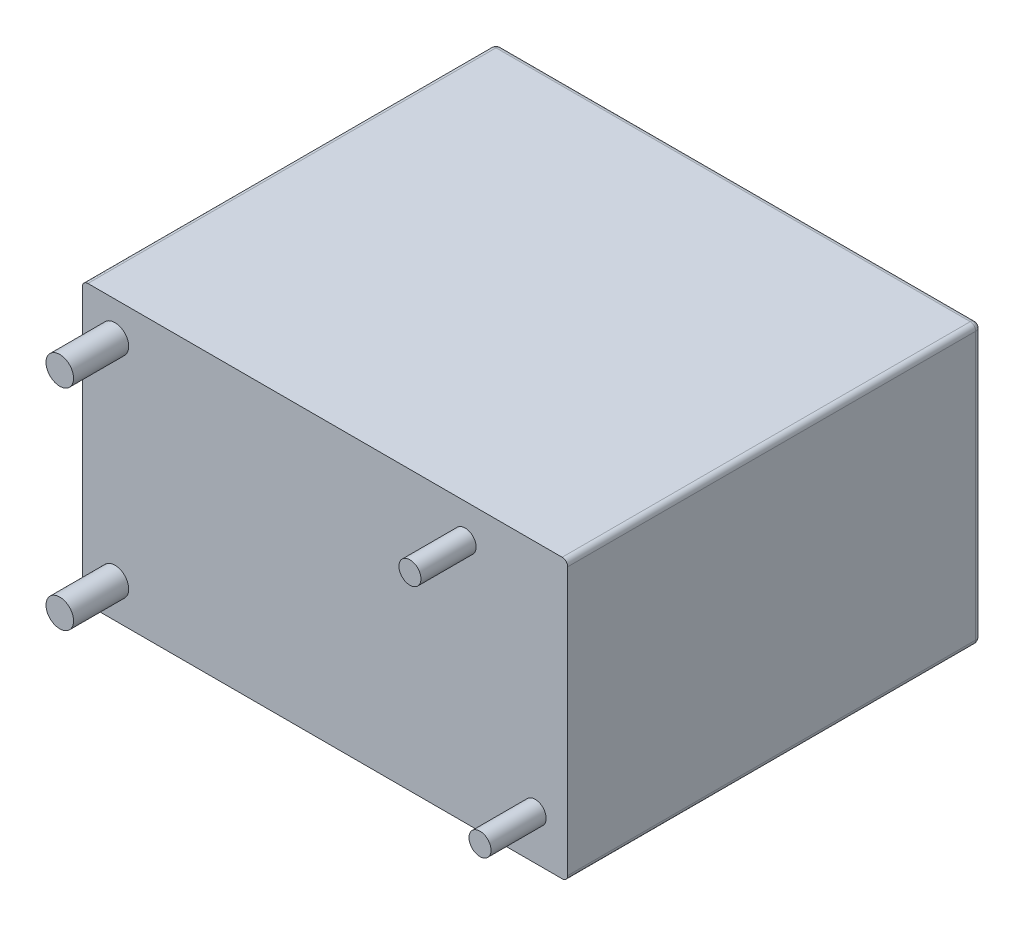
ISO-10303-21;
HEADER;
FILE_DESCRIPTION(('STEP AP214'),'2;1');
FILE_NAME('part.step','',(''),(''),'','','');
FILE_SCHEMA(('AUTOMOTIVE_DESIGN { 1 0 10303 214 1 1 1 1 }'));
ENDSEC;
DATA;
#1=APPLICATION_CONTEXT('core data for automotive mechanical design processes');
#2=APPLICATION_PROTOCOL_DEFINITION('international standard','automotive_design',2000,#1);
#3=PRODUCT_CONTEXT('',#1,'mechanical');
#4=PRODUCT('Part','Part','',(#3));
#5=PRODUCT_RELATED_PRODUCT_CATEGORY('part','',(#4));
#6=PRODUCT_DEFINITION_FORMATION('','',#4);
#7=PRODUCT_DEFINITION_CONTEXT('part definition',#1,'design');
#8=PRODUCT_DEFINITION('design','',#6,#7);
#9=PRODUCT_DEFINITION_SHAPE('','',#8);
#10=(LENGTH_UNIT() NAMED_UNIT(*) SI_UNIT(.MILLI.,.METRE.));
#11=(NAMED_UNIT(*) PLANE_ANGLE_UNIT() SI_UNIT($,.RADIAN.));
#12=(NAMED_UNIT(*) SI_UNIT($,.STERADIAN.) SOLID_ANGLE_UNIT());
#13=UNCERTAINTY_MEASURE_WITH_UNIT(LENGTH_MEASURE(1.E-05),#10,'distance_accuracy_value','');
#14=(GEOMETRIC_REPRESENTATION_CONTEXT(3) GLOBAL_UNCERTAINTY_ASSIGNED_CONTEXT((#13)) GLOBAL_UNIT_ASSIGNED_CONTEXT((#10,
#11,#12)) REPRESENTATION_CONTEXT('',''));
#15=CARTESIAN_POINT('',(0.,0.,0.));
#16=DIRECTION('',(0.,0.,1.));
#17=DIRECTION('',(1.,0.,0.));
#18=AXIS2_PLACEMENT_3D('',#15,#16,#17);
#19=CARTESIAN_POINT('',(0.,0.,-15.));
#20=DIRECTION('',(-1.,0.,0.));
#21=DIRECTION('',(0.,0.,1.));
#22=AXIS2_PLACEMENT_3D('',#19,#20,#21);
#23=PLANE('',#22);
#24=DIRECTION('',(0.,-1.,0.));
#25=VECTOR('',#24,1.);
#26=CARTESIAN_POINT('',(0.,0.,-14.8));
#27=LINE('',#26,#25);
#28=CARTESIAN_POINT('',(0.,9.9,-14.8));
#29=VERTEX_POINT('',#28);
#30=CARTESIAN_POINT('',(0.,0.2,-14.8));
#31=VERTEX_POINT('',#30);
#32=EDGE_CURVE('E156',#29,#31,#27,.T.);
#33=ORIENTED_EDGE('',*,*,#32,.T.);
#34=DIRECTION('',(0.,0.,1.));
#35=VECTOR('',#34,1.);
#36=CARTESIAN_POINT('',(0.,0.2,-15.));
#37=LINE('',#36,#35);
#38=CARTESIAN_POINT('',(0.,0.2,0.));
#39=VERTEX_POINT('',#38);
#40=EDGE_CURVE('E158',#31,#39,#37,.T.);
#41=ORIENTED_EDGE('',*,*,#40,.T.);
#42=DIRECTION('',(0.,-1.,0.));
#43=VECTOR('',#42,1.);
#44=CARTESIAN_POINT('',(0.,0.,0.));
#45=LINE('',#44,#43);
#46=CARTESIAN_POINT('',(0.,9.9,0.));
#47=VERTEX_POINT('',#46);
#48=EDGE_CURVE('E117',#47,#39,#45,.T.);
#49=ORIENTED_EDGE('',*,*,#48,.F.);
#50=DIRECTION('',(0.,0.,1.));
#51=VECTOR('',#50,1.);
#52=CARTESIAN_POINT('',(0.,9.9,-15.));
#53=LINE('',#52,#51);
#54=EDGE_CURVE('E154',#47,#29,#53,.F.);
#55=ORIENTED_EDGE('',*,*,#54,.T.);
#56=EDGE_LOOP('',(#33,#41,#49,#55));
#57=FACE_BOUND('',#56,.T.);
#58=ADVANCED_FACE('F35',(#57),#23,.T.);
#59=CARTESIAN_POINT('',(0.,10.1,-15.));
#60=DIRECTION('',(0.,1.,0.));
#61=DIRECTION('',(0.,0.,1.));
#62=AXIS2_PLACEMENT_3D('',#59,#60,#61);
#63=PLANE('',#62);
#64=DIRECTION('',(-1.,0.,0.));
#65=VECTOR('',#64,1.);
#66=CARTESIAN_POINT('',(0.,10.1,-14.8));
#67=LINE('',#66,#65);
#68=CARTESIAN_POINT('',(17.4,10.1,-14.8));
#69=VERTEX_POINT('',#68);
#70=CARTESIAN_POINT('',(0.2,10.1,-14.8));
#71=VERTEX_POINT('',#70);
#72=EDGE_CURVE('E51',#69,#71,#67,.T.);
#73=ORIENTED_EDGE('',*,*,#72,.T.);
#74=DIRECTION('',(0.,0.,1.));
#75=VECTOR('',#74,1.);
#76=CARTESIAN_POINT('',(0.2,10.1,-15.));
#77=LINE('',#76,#75);
#78=CARTESIAN_POINT('',(0.2,10.1,0.));
#79=VERTEX_POINT('',#78);
#80=EDGE_CURVE('E11',#71,#79,#77,.T.);
#81=ORIENTED_EDGE('',*,*,#80,.T.);
#82=DIRECTION('',(-1.,0.,0.));
#83=VECTOR('',#82,1.);
#84=CARTESIAN_POINT('',(0.,10.1,0.));
#85=LINE('',#84,#83);
#86=CARTESIAN_POINT('',(17.4,10.1,0.));
#87=VERTEX_POINT('',#86);
#88=EDGE_CURVE('E228',#87,#79,#85,.T.);
#89=ORIENTED_EDGE('',*,*,#88,.F.);
#90=DIRECTION('',(0.,0.,1.));
#91=VECTOR('',#90,1.);
#92=CARTESIAN_POINT('',(17.4,10.1,-15.));
#93=LINE('',#92,#91);
#94=EDGE_CURVE('E44',#87,#69,#93,.F.);
#95=ORIENTED_EDGE('',*,*,#94,.T.);
#96=EDGE_LOOP('',(#73,#81,#89,#95));
#97=FACE_BOUND('',#96,.T.);
#98=ADVANCED_FACE('F268',(#97),#63,.T.);
#99=CARTESIAN_POINT('',(17.6,0.,-15.));
#100=DIRECTION('',(1.,0.,0.));
#101=DIRECTION('',(0.,0.,-1.));
#102=AXIS2_PLACEMENT_3D('',#99,#100,#101);
#103=PLANE('',#102);
#104=DIRECTION('',(0.,1.,0.));
#105=VECTOR('',#104,1.);
#106=CARTESIAN_POINT('',(17.6,0.,0.));
#107=LINE('',#106,#105);
#108=CARTESIAN_POINT('',(17.6,0.2,0.));
#109=VERTEX_POINT('',#108);
#110=CARTESIAN_POINT('',(17.6,9.9,0.));
#111=VERTEX_POINT('',#110);
#112=EDGE_CURVE('E131',#109,#111,#107,.T.);
#113=ORIENTED_EDGE('',*,*,#112,.F.);
#114=DIRECTION('',(0.,0.,1.));
#115=VECTOR('',#114,1.);
#116=CARTESIAN_POINT('',(17.6,0.2,-15.));
#117=LINE('',#116,#115);
#118=CARTESIAN_POINT('',(17.6,0.2,-14.8));
#119=VERTEX_POINT('',#118);
#120=EDGE_CURVE('E152',#109,#119,#117,.F.);
#121=ORIENTED_EDGE('',*,*,#120,.T.);
#122=DIRECTION('',(0.,1.,0.));
#123=VECTOR('',#122,1.);
#124=CARTESIAN_POINT('',(17.6,0.,-14.8));
#125=LINE('',#124,#123);
#126=CARTESIAN_POINT('',(17.6,9.9,-14.8));
#127=VERTEX_POINT('',#126);
#128=EDGE_CURVE('E150',#119,#127,#125,.T.);
#129=ORIENTED_EDGE('',*,*,#128,.T.);
#130=DIRECTION('',(0.,0.,1.));
#131=VECTOR('',#130,1.);
#132=CARTESIAN_POINT('',(17.6,9.9,-15.));
#133=LINE('',#132,#131);
#134=EDGE_CURVE('E148',#127,#111,#133,.T.);
#135=ORIENTED_EDGE('',*,*,#134,.T.);
#136=EDGE_LOOP('',(#113,#121,#129,#135));
#137=FACE_BOUND('',#136,.T.);
#138=ADVANCED_FACE('F274',(#137),#103,.T.);
#139=CARTESIAN_POINT('',(0.,0.,-15.));
#140=DIRECTION('',(0.,-1.,0.));
#141=DIRECTION('',(0.,0.,-1.));
#142=AXIS2_PLACEMENT_3D('',#139,#140,#141);
#143=PLANE('',#142);
#144=DIRECTION('',(1.,0.,0.));
#145=VECTOR('',#144,1.);
#146=CARTESIAN_POINT('',(0.,0.,-14.8));
#147=LINE('',#146,#145);
#148=CARTESIAN_POINT('',(0.2,0.,-14.8));
#149=VERTEX_POINT('',#148);
#150=CARTESIAN_POINT('',(17.4,0.,-14.8));
#151=VERTEX_POINT('',#150);
#152=EDGE_CURVE('E137',#149,#151,#147,.T.);
#153=ORIENTED_EDGE('',*,*,#152,.T.);
#154=DIRECTION('',(0.,0.,1.));
#155=VECTOR('',#154,1.);
#156=CARTESIAN_POINT('',(17.4,0.,-15.));
#157=LINE('',#156,#155);
#158=CARTESIAN_POINT('',(17.4,0.,0.));
#159=VERTEX_POINT('',#158);
#160=EDGE_CURVE('E130',#151,#159,#157,.T.);
#161=ORIENTED_EDGE('',*,*,#160,.T.);
#162=DIRECTION('',(1.,0.,0.));
#163=VECTOR('',#162,1.);
#164=CARTESIAN_POINT('',(0.,0.,0.));
#165=LINE('',#164,#163);
#166=CARTESIAN_POINT('',(0.2,0.,0.));
#167=VERTEX_POINT('',#166);
#168=EDGE_CURVE('E115',#167,#159,#165,.T.);
#169=ORIENTED_EDGE('',*,*,#168,.F.);
#170=DIRECTION('',(0.,0.,1.));
#171=VECTOR('',#170,1.);
#172=CARTESIAN_POINT('',(0.2,0.,-15.));
#173=LINE('',#172,#171);
#174=EDGE_CURVE('E127',#167,#149,#173,.F.);
#175=ORIENTED_EDGE('',*,*,#174,.T.);
#176=EDGE_LOOP('',(#153,#161,#169,#175));
#177=FACE_BOUND('',#176,.T.);
#178=ADVANCED_FACE('F126',(#177),#143,.T.);
#179=CARTESIAN_POINT('',(0.,0.,-15.));
#180=DIRECTION('',(0.,0.,-1.));
#181=DIRECTION('',(-1.,0.,0.));
#182=AXIS2_PLACEMENT_3D('',#179,#180,#181);
#183=PLANE('',#182);
#184=CARTESIAN_POINT('',(15.9103179816337,8.79335190321311,-15.));
#185=DIRECTION('',(0.,0.,-1.));
#186=DIRECTION('',(-1.,0.,0.));
#187=AXIS2_PLACEMENT_3D('',#184,#185,#186);
#188=CIRCLE('',#187,0.500000000000001);
#189=CARTESIAN_POINT('',(15.4103179816337,8.79335190321311,-15.));
#190=VERTEX_POINT('',#189);
#191=EDGE_CURVE('E217',#190,#190,#188,.T.);
#192=ORIENTED_EDGE('',*,*,#191,.F.);
#193=EDGE_LOOP('',(#192));
#194=FACE_BOUND('',#193,.T.);
#195=DIRECTION('',(0.,1.,0.));
#196=VECTOR('',#195,1.);
#197=CARTESIAN_POINT('',(17.4,0.,-15.));
#198=LINE('',#197,#196);
#199=CARTESIAN_POINT('',(17.4,9.9,-15.));
#200=VERTEX_POINT('',#199);
#201=CARTESIAN_POINT('',(17.4,0.2,-15.));
#202=VERTEX_POINT('',#201);
#203=EDGE_CURVE('E164',#200,#202,#198,.F.);
#204=ORIENTED_EDGE('',*,*,#203,.T.);
#205=DIRECTION('',(1.,0.,0.));
#206=VECTOR('',#205,1.);
#207=CARTESIAN_POINT('',(0.,0.2,-15.));
#208=LINE('',#207,#206);
#209=CARTESIAN_POINT('',(0.2,0.2,-15.));
#210=VERTEX_POINT('',#209);
#211=EDGE_CURVE('E166',#202,#210,#208,.F.);
#212=ORIENTED_EDGE('',*,*,#211,.T.);
#213=DIRECTION('',(0.,-1.,0.));
#214=VECTOR('',#213,1.);
#215=CARTESIAN_POINT('',(0.2,0.,-15.));
#216=LINE('',#215,#214);
#217=CARTESIAN_POINT('',(0.2,9.9,-15.));
#218=VERTEX_POINT('',#217);
#219=EDGE_CURVE('E162',#210,#218,#216,.F.);
#220=ORIENTED_EDGE('',*,*,#219,.T.);
#221=DIRECTION('',(-1.,0.,0.));
#222=VECTOR('',#221,1.);
#223=CARTESIAN_POINT('',(0.,9.9,-15.));
#224=LINE('',#223,#222);
#225=EDGE_CURVE('E160',#218,#200,#224,.F.);
#226=ORIENTED_EDGE('',*,*,#225,.T.);
#227=EDGE_LOOP('',(#204,#212,#220,#226));
#228=FACE_BOUND('',#227,.T.);
#229=ADVANCED_FACE('F247',(#194,#228),#183,.T.);
#230=CARTESIAN_POINT('',(0.,0.,0.));
#231=DIRECTION('',(0.,0.,-1.));
#232=DIRECTION('',(-1.,0.,0.));
#233=AXIS2_PLACEMENT_3D('',#230,#231,#232);
#234=PLANE('',#233);
#235=CARTESIAN_POINT('',(1.18,1.24,0.));
#236=DIRECTION('',(0.,0.,-1.));
#237=DIRECTION('',(-1.,0.,0.));
#238=AXIS2_PLACEMENT_3D('',#235,#236,#237);
#239=CIRCLE('',#238,0.5);
#240=CARTESIAN_POINT('',(0.68,1.24,0.));
#241=VERTEX_POINT('',#240);
#242=EDGE_CURVE('E141',#241,#241,#239,.F.);
#243=ORIENTED_EDGE('',*,*,#242,.F.);
#244=EDGE_LOOP('',(#243));
#245=FACE_BOUND('',#244,.T.);
#246=CARTESIAN_POINT('',(16.42,1.6069825328216,0.));
#247=DIRECTION('',(0.,0.,-1.));
#248=DIRECTION('',(-1.,0.,0.));
#249=AXIS2_PLACEMENT_3D('',#246,#247,#248);
#250=CIRCLE('',#249,0.400000000000001);
#251=CARTESIAN_POINT('',(16.02,1.6069825328216,0.));
#252=VERTEX_POINT('',#251);
#253=EDGE_CURVE('E237',#252,#252,#250,.F.);
#254=ORIENTED_EDGE('',*,*,#253,.F.);
#255=EDGE_LOOP('',(#254));
#256=FACE_BOUND('',#255,.T.);
#257=CARTESIAN_POINT('',(13.88,8.86,0.));
#258=DIRECTION('',(0.,0.,-1.));
#259=DIRECTION('',(-1.,0.,0.));
#260=AXIS2_PLACEMENT_3D('',#257,#258,#259);
#261=CIRCLE('',#260,0.399999999999999);
#262=CARTESIAN_POINT('',(13.48,8.86,0.));
#263=VERTEX_POINT('',#262);
#264=EDGE_CURVE('E234',#263,#263,#261,.F.);
#265=ORIENTED_EDGE('',*,*,#264,.F.);
#266=EDGE_LOOP('',(#265));
#267=FACE_BOUND('',#266,.T.);
#268=CARTESIAN_POINT('',(1.18,8.86,0.));
#269=DIRECTION('',(0.,0.,-1.));
#270=DIRECTION('',(-1.,0.,0.));
#271=AXIS2_PLACEMENT_3D('',#268,#269,#270);
#272=CIRCLE('',#271,0.500000000000001);
#273=CARTESIAN_POINT('',(0.679999999999999,8.86,0.));
#274=VERTEX_POINT('',#273);
#275=EDGE_CURVE('E231',#274,#274,#272,.F.);
#276=ORIENTED_EDGE('',*,*,#275,.F.);
#277=EDGE_LOOP('',(#276));
#278=FACE_BOUND('',#277,.T.);
#279=ORIENTED_EDGE('',*,*,#168,.T.);
#280=CARTESIAN_POINT('',(17.4,0.2,0.));
#281=DIRECTION('',(0.,0.,-1.));
#282=DIRECTION('',(-1.,0.,0.));
#283=AXIS2_PLACEMENT_3D('',#280,#281,#282);
#284=CIRCLE('',#283,0.2);
#285=EDGE_CURVE('E121',#159,#109,#284,.F.);
#286=ORIENTED_EDGE('',*,*,#285,.T.);
#287=ORIENTED_EDGE('',*,*,#112,.T.);
#288=CARTESIAN_POINT('',(17.4,9.9,0.));
#289=DIRECTION('',(0.,0.,-1.));
#290=DIRECTION('',(-1.,0.,0.));
#291=AXIS2_PLACEMENT_3D('',#288,#289,#290);
#292=CIRCLE('',#291,0.2);
#293=EDGE_CURVE('E139',#111,#87,#292,.F.);
#294=ORIENTED_EDGE('',*,*,#293,.T.);
#295=ORIENTED_EDGE('',*,*,#88,.T.);
#296=CARTESIAN_POINT('',(0.2,9.9,0.));
#297=DIRECTION('',(0.,0.,-1.));
#298=DIRECTION('',(-1.,0.,0.));
#299=AXIS2_PLACEMENT_3D('',#296,#297,#298);
#300=CIRCLE('',#299,0.2);
#301=EDGE_CURVE('E122',#79,#47,#300,.F.);
#302=ORIENTED_EDGE('',*,*,#301,.T.);
#303=ORIENTED_EDGE('',*,*,#48,.T.);
#304=CARTESIAN_POINT('',(0.2,0.2,0.));
#305=DIRECTION('',(0.,0.,-1.));
#306=DIRECTION('',(-1.,0.,0.));
#307=AXIS2_PLACEMENT_3D('',#304,#305,#306);
#308=CIRCLE('',#307,0.2);
#309=EDGE_CURVE('E112',#39,#167,#308,.F.);
#310=ORIENTED_EDGE('',*,*,#309,.T.);
#311=EDGE_LOOP('',(#279,#286,#287,#294,#295,#302,#303,#310));
#312=FACE_BOUND('',#311,.T.);
#313=ADVANCED_FACE('F114',(#245,#256,#267,#278,#312),#234,.F.);
#314=CARTESIAN_POINT('',(1.18,8.86,2.));
#315=DIRECTION('',(0.,0.,-1.));
#316=DIRECTION('',(-1.,0.,0.));
#317=AXIS2_PLACEMENT_3D('',#314,#315,#316);
#318=CYLINDRICAL_SURFACE('',#317,0.500000000000001);
#319=CARTESIAN_POINT('',(1.18,8.86,2.));
#320=DIRECTION('',(0.,0.,1.));
#321=DIRECTION('',(1.,0.,0.));
#322=AXIS2_PLACEMENT_3D('',#319,#320,#321);
#323=CIRCLE('',#322,0.500000000000001);
#324=CARTESIAN_POINT('',(1.68,8.86,2.));
#325=VERTEX_POINT('',#324);
#326=EDGE_CURVE('E222',#325,#325,#323,.T.);
#327=ORIENTED_EDGE('',*,*,#326,.F.);
#328=EDGE_LOOP('',(#327));
#329=FACE_BOUND('',#328,.T.);
#330=ORIENTED_EDGE('',*,*,#275,.T.);
#331=EDGE_LOOP('',(#330));
#332=FACE_BOUND('',#331,.T.);
#333=ADVANCED_FACE('F246',(#329,#332),#318,.T.);
#334=CARTESIAN_POINT('',(1.18,8.86,2.));
#335=DIRECTION('',(0.,0.,1.));
#336=DIRECTION('',(1.,0.,0.));
#337=AXIS2_PLACEMENT_3D('',#334,#335,#336);
#338=PLANE('',#337);
#339=ORIENTED_EDGE('',*,*,#326,.T.);
#340=EDGE_LOOP('',(#339));
#341=FACE_BOUND('',#340,.T.);
#342=ADVANCED_FACE('F256',(#341),#338,.T.);
#343=CARTESIAN_POINT('',(13.88,8.86,2.));
#344=DIRECTION('',(0.,0.,-1.));
#345=DIRECTION('',(-1.,0.,0.));
#346=AXIS2_PLACEMENT_3D('',#343,#344,#345);
#347=CYLINDRICAL_SURFACE('',#346,0.399999999999999);
#348=CARTESIAN_POINT('',(13.88,8.86,2.));
#349=DIRECTION('',(0.,0.,1.));
#350=DIRECTION('',(1.,0.,0.));
#351=AXIS2_PLACEMENT_3D('',#348,#349,#350);
#352=CIRCLE('',#351,0.399999999999999);
#353=CARTESIAN_POINT('',(14.28,8.86,2.));
#354=VERTEX_POINT('',#353);
#355=EDGE_CURVE('E214',#354,#354,#352,.T.);
#356=ORIENTED_EDGE('',*,*,#355,.F.);
#357=EDGE_LOOP('',(#356));
#358=FACE_BOUND('',#357,.T.);
#359=ORIENTED_EDGE('',*,*,#264,.T.);
#360=EDGE_LOOP('',(#359));
#361=FACE_BOUND('',#360,.T.);
#362=ADVANCED_FACE('F262',(#358,#361),#347,.T.);
#363=CARTESIAN_POINT('',(13.88,8.86,2.));
#364=DIRECTION('',(0.,0.,1.));
#365=DIRECTION('',(1.,0.,0.));
#366=AXIS2_PLACEMENT_3D('',#363,#364,#365);
#367=PLANE('',#366);
#368=ORIENTED_EDGE('',*,*,#355,.T.);
#369=EDGE_LOOP('',(#368));
#370=FACE_BOUND('',#369,.T.);
#371=ADVANCED_FACE('F379',(#370),#367,.T.);
#372=CARTESIAN_POINT('',(16.42,1.6069825328216,2.));
#373=DIRECTION('',(0.,0.,-1.));
#374=DIRECTION('',(-1.,0.,0.));
#375=AXIS2_PLACEMENT_3D('',#372,#373,#374);
#376=CYLINDRICAL_SURFACE('',#375,0.400000000000001);
#377=CARTESIAN_POINT('',(16.42,1.6069825328216,2.));
#378=DIRECTION('',(0.,0.,1.));
#379=DIRECTION('',(1.,0.,0.));
#380=AXIS2_PLACEMENT_3D('',#377,#378,#379);
#381=CIRCLE('',#380,0.400000000000001);
#382=CARTESIAN_POINT('',(16.82,1.6069825328216,2.));
#383=VERTEX_POINT('',#382);
#384=EDGE_CURVE('E209',#383,#383,#381,.T.);
#385=ORIENTED_EDGE('',*,*,#384,.F.);
#386=EDGE_LOOP('',(#385));
#387=FACE_BOUND('',#386,.T.);
#388=ORIENTED_EDGE('',*,*,#253,.T.);
#389=EDGE_LOOP('',(#388));
#390=FACE_BOUND('',#389,.T.);
#391=ADVANCED_FACE('F375',(#387,#390),#376,.T.);
#392=CARTESIAN_POINT('',(16.42,1.6069825328216,2.));
#393=DIRECTION('',(0.,0.,1.));
#394=DIRECTION('',(1.,0.,0.));
#395=AXIS2_PLACEMENT_3D('',#392,#393,#394);
#396=PLANE('',#395);
#397=ORIENTED_EDGE('',*,*,#384,.T.);
#398=EDGE_LOOP('',(#397));
#399=FACE_BOUND('',#398,.T.);
#400=ADVANCED_FACE('F371',(#399),#396,.T.);
#401=CARTESIAN_POINT('',(1.18,1.24,2.));
#402=DIRECTION('',(0.,0.,-1.));
#403=DIRECTION('',(-1.,0.,0.));
#404=AXIS2_PLACEMENT_3D('',#401,#402,#403);
#405=CYLINDRICAL_SURFACE('',#404,0.5);
#406=CARTESIAN_POINT('',(1.18,1.24,2.));
#407=DIRECTION('',(0.,0.,1.));
#408=DIRECTION('',(-1.,0.,0.));
#409=AXIS2_PLACEMENT_3D('',#406,#407,#408);
#410=CIRCLE('',#409,0.5);
#411=CARTESIAN_POINT('',(0.68,1.24,2.));
#412=VERTEX_POINT('',#411);
#413=EDGE_CURVE('E204',#412,#412,#410,.T.);
#414=ORIENTED_EDGE('',*,*,#413,.F.);
#415=EDGE_LOOP('',(#414));
#416=FACE_BOUND('',#415,.T.);
#417=ORIENTED_EDGE('',*,*,#242,.T.);
#418=EDGE_LOOP('',(#417));
#419=FACE_BOUND('',#418,.T.);
#420=ADVANCED_FACE('F242',(#416,#419),#405,.T.);
#421=CARTESIAN_POINT('',(1.18,1.24,2.));
#422=DIRECTION('',(0.,0.,-1.));
#423=DIRECTION('',(-1.,0.,0.));
#424=AXIS2_PLACEMENT_3D('',#421,#422,#423);
#425=PLANE('',#424);
#426=ORIENTED_EDGE('',*,*,#413,.T.);
#427=EDGE_LOOP('',(#426));
#428=FACE_BOUND('',#427,.T.);
#429=ADVANCED_FACE('F321',(#428),#425,.F.);
#430=CARTESIAN_POINT('',(0.2,9.9,-15.));
#431=DIRECTION('',(0.,0.,1.));
#432=DIRECTION('',(1.,0.,0.));
#433=AXIS2_PLACEMENT_3D('',#430,#431,#432);
#434=CYLINDRICAL_SURFACE('',#433,0.2);
#435=CARTESIAN_POINT('',(0.2,9.9,-14.8));
#436=DIRECTION('',(0.,0.,-1.));
#437=DIRECTION('',(-1.,0.,0.));
#438=AXIS2_PLACEMENT_3D('',#435,#436,#437);
#439=CIRCLE('',#438,0.2);
#440=EDGE_CURVE('E39',#29,#71,#439,.T.);
#441=ORIENTED_EDGE('',*,*,#440,.F.);
#442=ORIENTED_EDGE('',*,*,#54,.F.);
#443=ORIENTED_EDGE('',*,*,#301,.F.);
#444=ORIENTED_EDGE('',*,*,#80,.F.);
#445=EDGE_LOOP('',(#441,#442,#443,#444));
#446=FACE_BOUND('',#445,.T.);
#447=ADVANCED_FACE('F37',(#446),#434,.T.);
#448=CARTESIAN_POINT('',(0.2,9.9,-14.8));
#449=DIRECTION('',(0.,0.,1.));
#450=DIRECTION('',(1.,0.,0.));
#451=AXIS2_PLACEMENT_3D('',#448,#449,#450);
#452=SPHERICAL_SURFACE('',#451,0.2);
#453=CARTESIAN_POINT('',(0.2,9.9,-14.8));
#454=DIRECTION('',(0.,1.,0.));
#455=DIRECTION('',(0.,0.,1.));
#456=AXIS2_PLACEMENT_3D('',#453,#454,#455);
#457=CIRCLE('',#456,0.2);
#458=EDGE_CURVE('E196',#29,#218,#457,.F.);
#459=ORIENTED_EDGE('',*,*,#458,.F.);
#460=ORIENTED_EDGE('',*,*,#440,.T.);
#461=CARTESIAN_POINT('',(0.2,9.9,-14.8));
#462=DIRECTION('',(-1.,0.,0.));
#463=DIRECTION('',(0.,0.,1.));
#464=AXIS2_PLACEMENT_3D('',#461,#462,#463);
#465=CIRCLE('',#464,0.2);
#466=EDGE_CURVE('E198',#218,#71,#465,.F.);
#467=ORIENTED_EDGE('',*,*,#466,.F.);
#468=EDGE_LOOP('',(#459,#460,#467));
#469=FACE_BOUND('',#468,.T.);
#470=ADVANCED_FACE('F315',(#469),#452,.T.);
#471=CARTESIAN_POINT('',(17.4,9.9,-15.));
#472=DIRECTION('',(0.,0.,1.));
#473=DIRECTION('',(1.,0.,0.));
#474=AXIS2_PLACEMENT_3D('',#471,#472,#473);
#475=CYLINDRICAL_SURFACE('',#474,0.2);
#476=ORIENTED_EDGE('',*,*,#293,.F.);
#477=ORIENTED_EDGE('',*,*,#134,.F.);
#478=CARTESIAN_POINT('',(17.4,9.9,-14.8));
#479=DIRECTION('',(0.,0.,-1.));
#480=DIRECTION('',(-1.,0.,0.));
#481=AXIS2_PLACEMENT_3D('',#478,#479,#480);
#482=CIRCLE('',#481,0.2);
#483=EDGE_CURVE('E193',#69,#127,#482,.T.);
#484=ORIENTED_EDGE('',*,*,#483,.F.);
#485=ORIENTED_EDGE('',*,*,#94,.F.);
#486=EDGE_LOOP('',(#476,#477,#484,#485));
#487=FACE_BOUND('',#486,.T.);
#488=ADVANCED_FACE('F313',(#487),#475,.T.);
#489=CARTESIAN_POINT('',(0.,9.9,-14.8));
#490=DIRECTION('',(-1.,0.,0.));
#491=DIRECTION('',(0.,0.,1.));
#492=AXIS2_PLACEMENT_3D('',#489,#490,#491);
#493=CYLINDRICAL_SURFACE('',#492,0.2);
#494=ORIENTED_EDGE('',*,*,#466,.T.);
#495=ORIENTED_EDGE('',*,*,#72,.F.);
#496=CARTESIAN_POINT('',(17.4,9.9,-14.8));
#497=DIRECTION('',(1.,0.,0.));
#498=DIRECTION('',(0.,0.,-1.));
#499=AXIS2_PLACEMENT_3D('',#496,#497,#498);
#500=CIRCLE('',#499,0.2);
#501=EDGE_CURVE('E190',#200,#69,#500,.T.);
#502=ORIENTED_EDGE('',*,*,#501,.F.);
#503=ORIENTED_EDGE('',*,*,#225,.F.);
#504=EDGE_LOOP('',(#494,#495,#502,#503));
#505=FACE_BOUND('',#504,.T.);
#506=ADVANCED_FACE('F309',(#505),#493,.T.);
#507=CARTESIAN_POINT('',(0.2,0.,-14.8));
#508=DIRECTION('',(0.,-1.,0.));
#509=DIRECTION('',(0.,0.,-1.));
#510=AXIS2_PLACEMENT_3D('',#507,#508,#509);
#511=CYLINDRICAL_SURFACE('',#510,0.2);
#512=ORIENTED_EDGE('',*,*,#458,.T.);
#513=ORIENTED_EDGE('',*,*,#219,.F.);
#514=CARTESIAN_POINT('',(0.2,0.2,-14.8));
#515=DIRECTION('',(0.,-1.,0.));
#516=DIRECTION('',(0.,0.,-1.));
#517=AXIS2_PLACEMENT_3D('',#514,#515,#516);
#518=CIRCLE('',#517,0.2);
#519=EDGE_CURVE('E187',#31,#210,#518,.T.);
#520=ORIENTED_EDGE('',*,*,#519,.F.);
#521=ORIENTED_EDGE('',*,*,#32,.F.);
#522=EDGE_LOOP('',(#512,#513,#520,#521));
#523=FACE_BOUND('',#522,.T.);
#524=ADVANCED_FACE('F306',(#523),#511,.T.);
#525=CARTESIAN_POINT('',(0.2,0.2,-15.));
#526=DIRECTION('',(0.,0.,1.));
#527=DIRECTION('',(1.,0.,0.));
#528=AXIS2_PLACEMENT_3D('',#525,#526,#527);
#529=CYLINDRICAL_SURFACE('',#528,0.2);
#530=ORIENTED_EDGE('',*,*,#309,.F.);
#531=ORIENTED_EDGE('',*,*,#40,.F.);
#532=CARTESIAN_POINT('',(0.2,0.2,-14.8));
#533=DIRECTION('',(0.,0.,-1.));
#534=DIRECTION('',(-1.,0.,0.));
#535=AXIS2_PLACEMENT_3D('',#532,#533,#534);
#536=CIRCLE('',#535,0.2);
#537=EDGE_CURVE('E135',#149,#31,#536,.T.);
#538=ORIENTED_EDGE('',*,*,#537,.F.);
#539=ORIENTED_EDGE('',*,*,#174,.F.);
#540=EDGE_LOOP('',(#530,#531,#538,#539));
#541=FACE_BOUND('',#540,.T.);
#542=ADVANCED_FACE('F133',(#541),#529,.T.);
#543=CARTESIAN_POINT('',(17.4,9.9,-14.8));
#544=DIRECTION('',(0.,0.,1.));
#545=DIRECTION('',(1.,0.,0.));
#546=AXIS2_PLACEMENT_3D('',#543,#544,#545);
#547=SPHERICAL_SURFACE('',#546,0.2);
#548=ORIENTED_EDGE('',*,*,#501,.T.);
#549=ORIENTED_EDGE('',*,*,#483,.T.);
#550=CARTESIAN_POINT('',(17.4,9.9,-14.8));
#551=DIRECTION('',(0.,1.,0.));
#552=DIRECTION('',(0.,0.,1.));
#553=AXIS2_PLACEMENT_3D('',#550,#551,#552);
#554=CIRCLE('',#553,0.2);
#555=EDGE_CURVE('E183',#200,#127,#554,.F.);
#556=ORIENTED_EDGE('',*,*,#555,.F.);
#557=EDGE_LOOP('',(#548,#549,#556));
#558=FACE_BOUND('',#557,.T.);
#559=ADVANCED_FACE('F299',(#558),#547,.T.);
#560=CARTESIAN_POINT('',(0.2,0.2,-14.8));
#561=DIRECTION('',(0.,0.,1.));
#562=DIRECTION('',(1.,0.,0.));
#563=AXIS2_PLACEMENT_3D('',#560,#561,#562);
#564=SPHERICAL_SURFACE('',#563,0.2);
#565=ORIENTED_EDGE('',*,*,#537,.T.);
#566=ORIENTED_EDGE('',*,*,#519,.T.);
#567=CARTESIAN_POINT('',(0.2,0.2,-14.8));
#568=DIRECTION('',(-1.,0.,0.));
#569=DIRECTION('',(0.,0.,1.));
#570=AXIS2_PLACEMENT_3D('',#567,#568,#569);
#571=CIRCLE('',#570,0.2);
#572=EDGE_CURVE('E181',#149,#210,#571,.F.);
#573=ORIENTED_EDGE('',*,*,#572,.F.);
#574=EDGE_LOOP('',(#565,#566,#573));
#575=FACE_BOUND('',#574,.T.);
#576=ADVANCED_FACE('F295',(#575),#564,.T.);
#577=CARTESIAN_POINT('',(17.4,0.,-14.8));
#578=DIRECTION('',(0.,1.,0.));
#579=DIRECTION('',(0.,0.,1.));
#580=AXIS2_PLACEMENT_3D('',#577,#578,#579);
#581=CYLINDRICAL_SURFACE('',#580,0.2);
#582=ORIENTED_EDGE('',*,*,#555,.T.);
#583=ORIENTED_EDGE('',*,*,#128,.F.);
#584=CARTESIAN_POINT('',(17.4,0.2,-14.8));
#585=DIRECTION('',(0.,-1.,0.));
#586=DIRECTION('',(0.,0.,-1.));
#587=AXIS2_PLACEMENT_3D('',#584,#585,#586);
#588=CIRCLE('',#587,0.2);
#589=EDGE_CURVE('E178',#202,#119,#588,.T.);
#590=ORIENTED_EDGE('',*,*,#589,.F.);
#591=ORIENTED_EDGE('',*,*,#203,.F.);
#592=EDGE_LOOP('',(#582,#583,#590,#591));
#593=FACE_BOUND('',#592,.T.);
#594=ADVANCED_FACE('F291',(#593),#581,.T.);
#595=CARTESIAN_POINT('',(0.,0.2,-14.8));
#596=DIRECTION('',(1.,0.,0.));
#597=DIRECTION('',(0.,0.,-1.));
#598=AXIS2_PLACEMENT_3D('',#595,#596,#597);
#599=CYLINDRICAL_SURFACE('',#598,0.2);
#600=ORIENTED_EDGE('',*,*,#572,.T.);
#601=ORIENTED_EDGE('',*,*,#211,.F.);
#602=CARTESIAN_POINT('',(17.4,0.2,-14.8));
#603=DIRECTION('',(1.,0.,0.));
#604=DIRECTION('',(0.,0.,-1.));
#605=AXIS2_PLACEMENT_3D('',#602,#603,#604);
#606=CIRCLE('',#605,0.2);
#607=EDGE_CURVE('E174',#151,#202,#606,.T.);
#608=ORIENTED_EDGE('',*,*,#607,.F.);
#609=ORIENTED_EDGE('',*,*,#152,.F.);
#610=EDGE_LOOP('',(#600,#601,#608,#609));
#611=FACE_BOUND('',#610,.T.);
#612=ADVANCED_FACE('F287',(#611),#599,.T.);
#613=CARTESIAN_POINT('',(17.4,0.2,-14.8));
#614=DIRECTION('',(0.,0.,1.));
#615=DIRECTION('',(1.,0.,0.));
#616=AXIS2_PLACEMENT_3D('',#613,#614,#615);
#617=SPHERICAL_SURFACE('',#616,0.2);
#618=ORIENTED_EDGE('',*,*,#607,.T.);
#619=ORIENTED_EDGE('',*,*,#589,.T.);
#620=CARTESIAN_POINT('',(17.4,0.2,-14.8));
#621=DIRECTION('',(0.,0.,-1.));
#622=DIRECTION('',(-1.,0.,0.));
#623=AXIS2_PLACEMENT_3D('',#620,#621,#622);
#624=CIRCLE('',#623,0.2);
#625=EDGE_CURVE('E171',#151,#119,#624,.F.);
#626=ORIENTED_EDGE('',*,*,#625,.F.);
#627=EDGE_LOOP('',(#618,#619,#626));
#628=FACE_BOUND('',#627,.T.);
#629=ADVANCED_FACE('F283',(#628),#617,.T.);
#630=CARTESIAN_POINT('',(17.4,0.2,-15.));
#631=DIRECTION('',(0.,0.,1.));
#632=DIRECTION('',(1.,0.,0.));
#633=AXIS2_PLACEMENT_3D('',#630,#631,#632);
#634=CYLINDRICAL_SURFACE('',#633,0.2);
#635=ORIENTED_EDGE('',*,*,#625,.T.);
#636=ORIENTED_EDGE('',*,*,#120,.F.);
#637=ORIENTED_EDGE('',*,*,#285,.F.);
#638=ORIENTED_EDGE('',*,*,#160,.F.);
#639=EDGE_LOOP('',(#635,#636,#637,#638));
#640=FACE_BOUND('',#639,.T.);
#641=ADVANCED_FACE('F279',(#640),#634,.T.);
#642=CARTESIAN_POINT('',(15.9103179816337,8.79335190321311,-14.5));
#643=DIRECTION('',(0.,0.,-1.));
#644=DIRECTION('',(-1.,0.,0.));
#645=AXIS2_PLACEMENT_3D('',#642,#643,#644);
#646=CYLINDRICAL_SURFACE('',#645,0.500000000000001);
#647=CARTESIAN_POINT('',(15.9103179816337,8.79335190321311,-14.5));
#648=DIRECTION('',(0.,0.,-1.));
#649=DIRECTION('',(-1.,0.,0.));
#650=AXIS2_PLACEMENT_3D('',#647,#648,#649);
#651=CIRCLE('',#650,0.500000000000001);
#652=CARTESIAN_POINT('',(15.4103179816337,8.79335190321311,-14.5));
#653=VERTEX_POINT('',#652);
#654=EDGE_CURVE('E175',#653,#653,#651,.T.);
#655=ORIENTED_EDGE('',*,*,#654,.F.);
#656=EDGE_LOOP('',(#655));
#657=FACE_BOUND('',#656,.T.);
#658=ORIENTED_EDGE('',*,*,#191,.T.);
#659=EDGE_LOOP('',(#658));
#660=FACE_BOUND('',#659,.T.);
#661=ADVANCED_FACE('F282',(#657,#660),#646,.F.);
#662=CARTESIAN_POINT('',(15.9103179816337,8.79335190321311,-14.5));
#663=DIRECTION('',(0.,0.,-1.));
#664=DIRECTION('',(-1.,0.,0.));
#665=AXIS2_PLACEMENT_3D('',#662,#663,#664);
#666=PLANE('',#665);
#667=ORIENTED_EDGE('',*,*,#654,.T.);
#668=EDGE_LOOP('',(#667));
#669=FACE_BOUND('',#668,.T.);
#670=ADVANCED_FACE('F358',(#669),#666,.T.);
#671=CLOSED_SHELL('',(#58,#98,#138,#178,#229,#313,#333,#342,#362,#371,#391,#400,#420,#429,#447,
#470,#488,#506,#524,#542,#559,#576,#594,#612,#629,#641,#661,#670));
#672=MANIFOLD_SOLID_BREP('B2',#671);
#673=ADVANCED_BREP_SHAPE_REPRESENTATION('',(#18,#672),#14);
#674=SHAPE_DEFINITION_REPRESENTATION(#9,#673);
ENDSEC;
END-ISO-10303-21;
